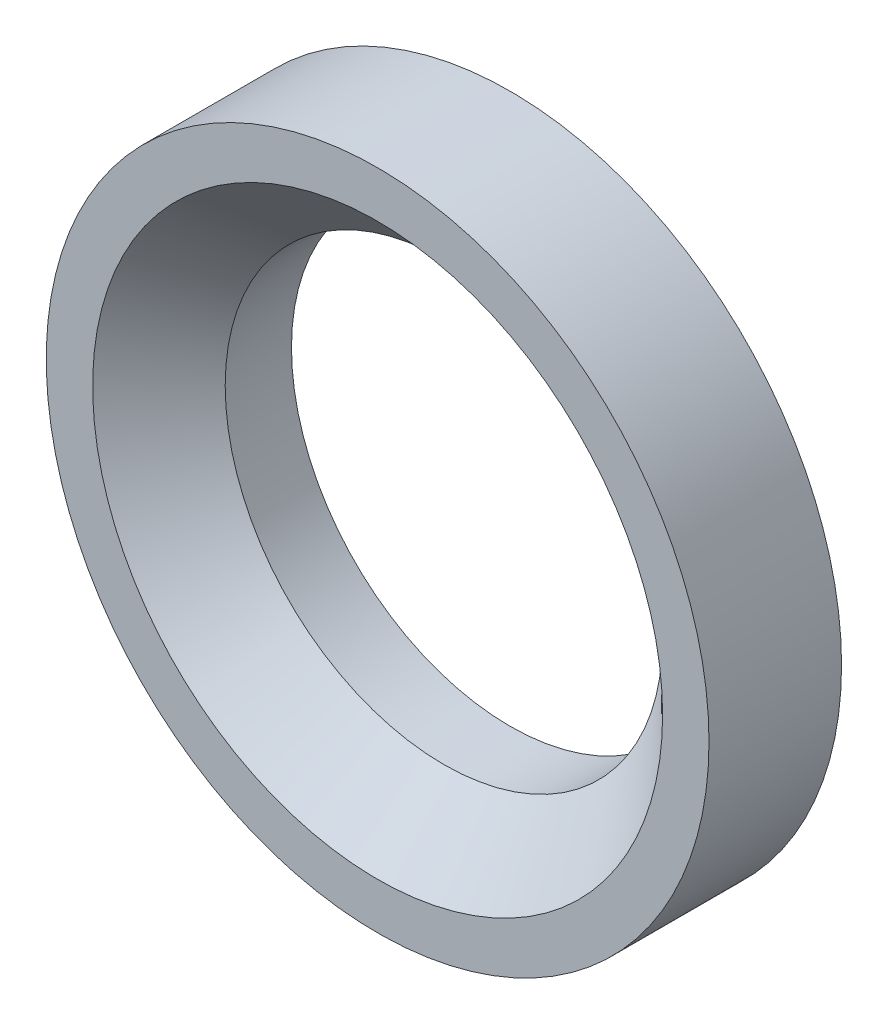
ISO-10303-21;
HEADER;
FILE_DESCRIPTION(('STEP AP214'),'2;1');
FILE_NAME('part.step','',(''),(''),'','','');
FILE_SCHEMA(('AUTOMOTIVE_DESIGN { 1 0 10303 214 1 1 1 1 }'));
ENDSEC;
DATA;
#1=APPLICATION_CONTEXT('core data for automotive mechanical design processes');
#2=APPLICATION_PROTOCOL_DEFINITION('international standard','automotive_design',2000,#1);
#3=PRODUCT_CONTEXT('',#1,'mechanical');
#4=PRODUCT('Part','Part','',(#3));
#5=PRODUCT_RELATED_PRODUCT_CATEGORY('part','',(#4));
#6=PRODUCT_DEFINITION_FORMATION('','',#4);
#7=PRODUCT_DEFINITION_CONTEXT('part definition',#1,'design');
#8=PRODUCT_DEFINITION('design','',#6,#7);
#9=PRODUCT_DEFINITION_SHAPE('','',#8);
#10=(LENGTH_UNIT() NAMED_UNIT(*) SI_UNIT(.MILLI.,.METRE.));
#11=(NAMED_UNIT(*) PLANE_ANGLE_UNIT() SI_UNIT($,.RADIAN.));
#12=(NAMED_UNIT(*) SI_UNIT($,.STERADIAN.) SOLID_ANGLE_UNIT());
#13=UNCERTAINTY_MEASURE_WITH_UNIT(LENGTH_MEASURE(1.E-05),#10,'distance_accuracy_value','');
#14=(GEOMETRIC_REPRESENTATION_CONTEXT(3) GLOBAL_UNCERTAINTY_ASSIGNED_CONTEXT((#13)) GLOBAL_UNIT_ASSIGNED_CONTEXT((#10,
#11,#12)) REPRESENTATION_CONTEXT('',''));
#15=CARTESIAN_POINT('',(0.,0.,0.));
#16=DIRECTION('',(0.,0.,1.));
#17=DIRECTION('',(1.,0.,0.));
#18=AXIS2_PLACEMENT_3D('',#15,#16,#17);
#19=CARTESIAN_POINT('',(0.,0.,2.54));
#20=DIRECTION('',(0.,0.,1.));
#21=DIRECTION('',(1.,0.,0.));
#22=AXIS2_PLACEMENT_3D('',#19,#20,#21);
#23=PLANE('',#22);
#24=CARTESIAN_POINT('',(0.,0.,2.54));
#25=DIRECTION('',(0.,0.,1.));
#26=DIRECTION('',(1.,0.,0.));
#27=AXIS2_PLACEMENT_3D('',#24,#25,#26);
#28=CIRCLE('',#27,5.46100000000001);
#29=CARTESIAN_POINT('',(5.46100000000001,0.,2.54));
#30=VERTEX_POINT('',#29);
#31=EDGE_CURVE('E10',#30,#30,#28,.F.);
#32=ORIENTED_EDGE('',*,*,#31,.T.);
#33=EDGE_LOOP('',(#32));
#34=FACE_BOUND('',#33,.T.);
#35=CARTESIAN_POINT('',(0.,0.,2.54));
#36=DIRECTION('',(0.,0.,1.));
#37=DIRECTION('',(1.,0.,0.));
#38=AXIS2_PLACEMENT_3D('',#35,#36,#37);
#39=CIRCLE('',#38,6.35);
#40=CARTESIAN_POINT('',(6.35,0.,2.54));
#41=VERTEX_POINT('',#40);
#42=EDGE_CURVE('E50',#41,#41,#39,.T.);
#43=ORIENTED_EDGE('',*,*,#42,.T.);
#44=EDGE_LOOP('',(#43));
#45=FACE_BOUND('',#44,.T.);
#46=ADVANCED_FACE('F37',(#34,#45),#23,.T.);
#47=CARTESIAN_POINT('',(0.,0.,0.));
#48=DIRECTION('',(0.,0.,1.));
#49=DIRECTION('',(1.,0.,0.));
#50=AXIS2_PLACEMENT_3D('',#47,#48,#49);
#51=PLANE('',#50);
#52=CARTESIAN_POINT('',(0.,0.,0.));
#53=DIRECTION('',(0.,0.,1.));
#54=DIRECTION('',(1.,0.,0.));
#55=AXIS2_PLACEMENT_3D('',#52,#53,#54);
#56=CIRCLE('',#55,6.35);
#57=CARTESIAN_POINT('',(6.35,0.,0.));
#58=VERTEX_POINT('',#57);
#59=EDGE_CURVE('E55',#58,#58,#56,.T.);
#60=ORIENTED_EDGE('',*,*,#59,.F.);
#61=EDGE_LOOP('',(#60));
#62=FACE_BOUND('',#61,.T.);
#63=CARTESIAN_POINT('',(0.,0.,0.));
#64=DIRECTION('',(0.,0.,1.));
#65=DIRECTION('',(1.,0.,0.));
#66=AXIS2_PLACEMENT_3D('',#63,#64,#65);
#67=CIRCLE('',#66,4.191);
#68=CARTESIAN_POINT('',(4.191,0.,0.));
#69=VERTEX_POINT('',#68);
#70=EDGE_CURVE('E60',#69,#69,#67,.T.);
#71=ORIENTED_EDGE('',*,*,#70,.T.);
#72=EDGE_LOOP('',(#71));
#73=FACE_BOUND('',#72,.T.);
#74=ADVANCED_FACE('F66',(#62,#73),#51,.F.);
#75=CARTESIAN_POINT('',(0.,0.,2.54));
#76=DIRECTION('',(0.,0.,-1.));
#77=DIRECTION('',(-1.,0.,0.));
#78=AXIS2_PLACEMENT_3D('',#75,#76,#77);
#79=CYLINDRICAL_SURFACE('',#78,6.35);
#80=ORIENTED_EDGE('',*,*,#42,.F.);
#81=EDGE_LOOP('',(#80));
#82=FACE_BOUND('',#81,.T.);
#83=ORIENTED_EDGE('',*,*,#59,.T.);
#84=EDGE_LOOP('',(#83));
#85=FACE_BOUND('',#84,.T.);
#86=ADVANCED_FACE('F70',(#82,#85),#79,.T.);
#87=CARTESIAN_POINT('',(0.,0.,2.54));
#88=DIRECTION('',(0.,0.,-1.));
#89=DIRECTION('',(-1.,0.,0.));
#90=AXIS2_PLACEMENT_3D('',#87,#88,#89);
#91=CYLINDRICAL_SURFACE('',#90,4.191);
#92=CARTESIAN_POINT('',(0.,0.,1.26999999999999));
#93=DIRECTION('',(0.,0.,1.));
#94=DIRECTION('',(1.,0.,0.));
#95=AXIS2_PLACEMENT_3D('',#92,#93,#94);
#96=CIRCLE('',#95,4.191);
#97=CARTESIAN_POINT('',(4.191,0.,1.26999999999999));
#98=VERTEX_POINT('',#97);
#99=EDGE_CURVE('E45',#98,#98,#96,.T.);
#100=ORIENTED_EDGE('',*,*,#99,.T.);
#101=EDGE_LOOP('',(#100));
#102=FACE_BOUND('',#101,.T.);
#103=ORIENTED_EDGE('',*,*,#70,.F.);
#104=EDGE_LOOP('',(#103));
#105=FACE_BOUND('',#104,.T.);
#106=ADVANCED_FACE('F68',(#102,#105),#91,.F.);
#107=CARTESIAN_POINT('',(0.,0.,1.26999999999999));
#108=DIRECTION('',(0.,0.,1.));
#109=DIRECTION('',(1.,0.,0.));
#110=AXIS2_PLACEMENT_3D('',#107,#108,#109);
#111=CONICAL_SURFACE('',#110,4.191,0.785398163397449);
#112=ORIENTED_EDGE('',*,*,#31,.F.);
#113=EDGE_LOOP('',(#112));
#114=FACE_BOUND('',#113,.T.);
#115=ORIENTED_EDGE('',*,*,#99,.F.);
#116=EDGE_LOOP('',(#115));
#117=FACE_BOUND('',#116,.T.);
#118=ADVANCED_FACE('F39',(#114,#117),#111,.F.);
#119=CLOSED_SHELL('',(#46,#74,#86,#106,#118));
#120=MANIFOLD_SOLID_BREP('B2',#119);
#121=ADVANCED_BREP_SHAPE_REPRESENTATION('',(#18,#120),#14);
#122=SHAPE_DEFINITION_REPRESENTATION(#9,#121);
ENDSEC;
END-ISO-10303-21;
